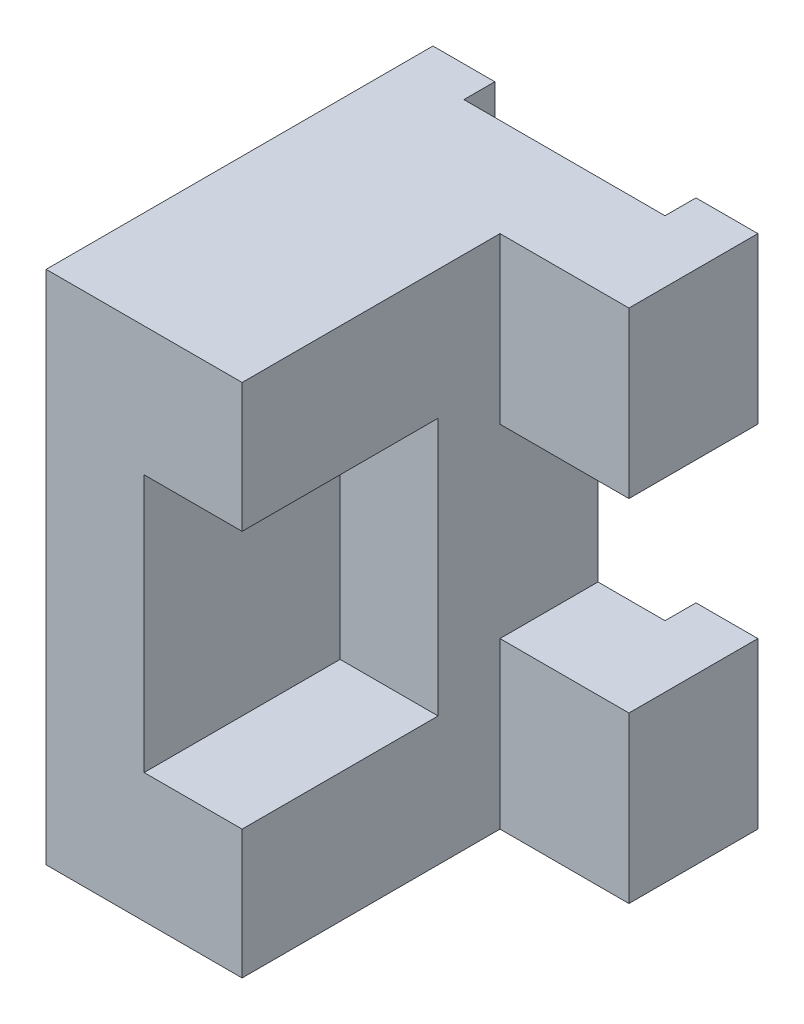
ISO-10303-21;
HEADER;
FILE_DESCRIPTION(('STEP AP214'),'2;1');
FILE_NAME('part.step','',(''),(''),'','','');
FILE_SCHEMA(('AUTOMOTIVE_DESIGN { 1 0 10303 214 1 1 1 1 }'));
ENDSEC;
DATA;
#1=APPLICATION_CONTEXT('core data for automotive mechanical design processes');
#2=APPLICATION_PROTOCOL_DEFINITION('international standard','automotive_design',2000,#1);
#3=PRODUCT_CONTEXT('',#1,'mechanical');
#4=PRODUCT('Part','Part','',(#3));
#5=PRODUCT_RELATED_PRODUCT_CATEGORY('part','',(#4));
#6=PRODUCT_DEFINITION_FORMATION('','',#4);
#7=PRODUCT_DEFINITION_CONTEXT('part definition',#1,'design');
#8=PRODUCT_DEFINITION('design','',#6,#7);
#9=PRODUCT_DEFINITION_SHAPE('','',#8);
#10=(LENGTH_UNIT() NAMED_UNIT(*) SI_UNIT(.MILLI.,.METRE.));
#11=(NAMED_UNIT(*) PLANE_ANGLE_UNIT() SI_UNIT($,.RADIAN.));
#12=(NAMED_UNIT(*) SI_UNIT($,.STERADIAN.) SOLID_ANGLE_UNIT());
#13=UNCERTAINTY_MEASURE_WITH_UNIT(LENGTH_MEASURE(1.E-05),#10,'distance_accuracy_value','');
#14=(GEOMETRIC_REPRESENTATION_CONTEXT(3) GLOBAL_UNCERTAINTY_ASSIGNED_CONTEXT((#13)) GLOBAL_UNIT_ASSIGNED_CONTEXT((#10,
#11,#12)) REPRESENTATION_CONTEXT('',''));
#15=CARTESIAN_POINT('',(0.,0.,0.));
#16=DIRECTION('',(0.,0.,1.));
#17=DIRECTION('',(1.,0.,0.));
#18=AXIS2_PLACEMENT_3D('',#15,#16,#17);
#19=CARTESIAN_POINT('',(0.,50.,25.0000000000028));
#20=DIRECTION('',(-1.,0.,0.));
#21=DIRECTION('',(0.,0.,1.));
#22=AXIS2_PLACEMENT_3D('',#19,#20,#21);
#23=PLANE('',#22);
#24=DIRECTION('',(0.,-1.,0.));
#25=VECTOR('',#24,1.);
#26=CARTESIAN_POINT('',(0.,50.,0.));
#27=LINE('',#26,#25);
#28=CARTESIAN_POINT('',(0.,-18.,0.));
#29=VERTEX_POINT('',#28);
#30=CARTESIAN_POINT('',(0.,-50.,0.));
#31=VERTEX_POINT('',#30);
#32=EDGE_CURVE('E47',#29,#31,#27,.T.);
#33=ORIENTED_EDGE('',*,*,#32,.F.);
#34=DIRECTION('',(0.,0.,1.));
#35=VECTOR('',#34,1.);
#36=CARTESIAN_POINT('',(0.,-18.,-12.9999999999972));
#37=LINE('',#36,#35);
#38=CARTESIAN_POINT('',(0.,-18.,25.0000000000028));
#39=VERTEX_POINT('',#38);
#40=EDGE_CURVE('E352',#29,#39,#37,.T.);
#41=ORIENTED_EDGE('',*,*,#40,.T.);
#42=DIRECTION('',(0.,-1.,0.));
#43=VECTOR('',#42,1.);
#44=CARTESIAN_POINT('',(0.,50.,25.0000000000028));
#45=LINE('',#44,#43);
#46=CARTESIAN_POINT('',(0.,-50.,25.0000000000028));
#47=VERTEX_POINT('',#46);
#48=EDGE_CURVE('E304',#39,#47,#45,.T.);
#49=ORIENTED_EDGE('',*,*,#48,.T.);
#50=DIRECTION('',(0.,0.,-1.));
#51=VECTOR('',#50,1.);
#52=CARTESIAN_POINT('',(0.,-50.,25.0000000000028));
#53=LINE('',#52,#51);
#54=EDGE_CURVE('E253',#47,#31,#53,.T.);
#55=ORIENTED_EDGE('',*,*,#54,.T.);
#56=EDGE_LOOP('',(#33,#41,#49,#55));
#57=FACE_BOUND('',#56,.T.);
#58=ADVANCED_FACE('F39',(#57),#23,.F.);
#59=CARTESIAN_POINT('',(0.,50.,0.));
#60=DIRECTION('',(0.,0.,1.));
#61=DIRECTION('',(1.,0.,0.));
#62=AXIS2_PLACEMENT_3D('',#59,#60,#61);
#63=PLANE('',#62);
#64=DIRECTION('',(0.,-1.,0.));
#65=VECTOR('',#64,1.);
#66=CARTESIAN_POINT('',(-12.,50.,0.));
#67=LINE('',#66,#65);
#68=CARTESIAN_POINT('',(-12.,-18.,0.));
#69=VERTEX_POINT('',#68);
#70=CARTESIAN_POINT('',(-12.,-50.,0.));
#71=VERTEX_POINT('',#70);
#72=EDGE_CURVE('E226',#69,#71,#67,.T.);
#73=ORIENTED_EDGE('',*,*,#72,.F.);
#74=DIRECTION('',(1.,0.,0.));
#75=VECTOR('',#74,1.);
#76=CARTESIAN_POINT('',(0.,-18.,0.));
#77=LINE('',#76,#75);
#78=EDGE_CURVE('E331',#69,#29,#77,.T.);
#79=ORIENTED_EDGE('',*,*,#78,.T.);
#80=ORIENTED_EDGE('',*,*,#32,.T.);
#81=DIRECTION('',(-1.,0.,0.));
#82=VECTOR('',#81,1.);
#83=CARTESIAN_POINT('',(0.,-50.,0.));
#84=LINE('',#83,#82);
#85=EDGE_CURVE('E247',#31,#71,#84,.T.);
#86=ORIENTED_EDGE('',*,*,#85,.T.);
#87=EDGE_LOOP('',(#73,#79,#80,#86));
#88=FACE_BOUND('',#87,.T.);
#89=ADVANCED_FACE('F248',(#88),#63,.F.);
#90=CARTESIAN_POINT('',(-12.,50.,0.));
#91=DIRECTION('',(1.,0.,0.));
#92=DIRECTION('',(0.,0.,-1.));
#93=AXIS2_PLACEMENT_3D('',#90,#91,#92);
#94=PLANE('',#93);
#95=DIRECTION('',(0.,-1.,0.));
#96=VECTOR('',#95,1.);
#97=CARTESIAN_POINT('',(-12.,50.,6.));
#98=LINE('',#97,#96);
#99=CARTESIAN_POINT('',(-12.,-18.,6.));
#100=VERTEX_POINT('',#99);
#101=CARTESIAN_POINT('',(-12.,-50.,6.));
#102=VERTEX_POINT('',#101);
#103=EDGE_CURVE('E223',#100,#102,#98,.T.);
#104=ORIENTED_EDGE('',*,*,#103,.F.);
#105=DIRECTION('',(0.,0.,-1.));
#106=VECTOR('',#105,1.);
#107=CARTESIAN_POINT('',(-12.,-18.,0.));
#108=LINE('',#107,#106);
#109=EDGE_CURVE('E243',#100,#69,#108,.T.);
#110=ORIENTED_EDGE('',*,*,#109,.T.);
#111=ORIENTED_EDGE('',*,*,#72,.T.);
#112=DIRECTION('',(0.,0.,1.));
#113=VECTOR('',#112,1.);
#114=CARTESIAN_POINT('',(-12.,-50.,0.));
#115=LINE('',#114,#113);
#116=EDGE_CURVE('E241',#71,#102,#115,.T.);
#117=ORIENTED_EDGE('',*,*,#116,.T.);
#118=EDGE_LOOP('',(#104,#110,#111,#117));
#119=FACE_BOUND('',#118,.T.);
#120=ADVANCED_FACE('F239',(#119),#94,.F.);
#121=CARTESIAN_POINT('',(-25.,50.,25.0000000000028));
#122=DIRECTION('',(0.,0.,-1.));
#123=DIRECTION('',(-1.,0.,0.));
#124=AXIS2_PLACEMENT_3D('',#121,#122,#123);
#125=PLANE('',#124);
#126=ORIENTED_EDGE('',*,*,#48,.F.);
#127=DIRECTION('',(1.,0.,0.));
#128=VECTOR('',#127,1.);
#129=CARTESIAN_POINT('',(0.,-18.,25.0000000000028));
#130=LINE('',#129,#128);
#131=CARTESIAN_POINT('',(-25.,-18.,25.0000000000028));
#132=VERTEX_POINT('',#131);
#133=EDGE_CURVE('E197',#132,#39,#130,.T.);
#134=ORIENTED_EDGE('',*,*,#133,.F.);
#135=DIRECTION('',(0.,-1.,0.));
#136=VECTOR('',#135,1.);
#137=CARTESIAN_POINT('',(-25.,50.,25.0000000000028));
#138=LINE('',#137,#136);
#139=CARTESIAN_POINT('',(-25.,-50.,25.0000000000028));
#140=VERTEX_POINT('',#139);
#141=EDGE_CURVE('E202',#132,#140,#138,.T.);
#142=ORIENTED_EDGE('',*,*,#141,.T.);
#143=DIRECTION('',(1.,0.,0.));
#144=VECTOR('',#143,1.);
#145=CARTESIAN_POINT('',(-25.,-50.,25.0000000000028));
#146=LINE('',#145,#144);
#147=EDGE_CURVE('E273',#140,#47,#146,.T.);
#148=ORIENTED_EDGE('',*,*,#147,.T.);
#149=EDGE_LOOP('',(#126,#134,#142,#148));
#150=FACE_BOUND('',#149,.T.);
#151=ADVANCED_FACE('F361',(#150),#125,.F.);
#152=CARTESIAN_POINT('',(0.,50.,25.0000000000028));
#153=VERTEX_POINT('',#152);
#154=CARTESIAN_POINT('',(0.,18.,25.0000000000028));
#155=VERTEX_POINT('',#154);
#156=EDGE_CURVE('E206',#153,#155,#45,.T.);
#157=ORIENTED_EDGE('',*,*,#156,.T.);
#158=DIRECTION('',(0.,0.,1.));
#159=VECTOR('',#158,1.);
#160=CARTESIAN_POINT('',(0.,18.,-12.9999999999972));
#161=LINE('',#160,#159);
#162=CARTESIAN_POINT('',(0.,18.,0.));
#163=VERTEX_POINT('',#162);
#164=EDGE_CURVE('E54',#163,#155,#161,.T.);
#165=ORIENTED_EDGE('',*,*,#164,.F.);
#166=CARTESIAN_POINT('',(0.,50.,0.));
#167=VERTEX_POINT('',#166);
#168=EDGE_CURVE('E11',#167,#163,#27,.T.);
#169=ORIENTED_EDGE('',*,*,#168,.F.);
#170=DIRECTION('',(0.,0.,-1.));
#171=VECTOR('',#170,1.);
#172=CARTESIAN_POINT('',(0.,50.,25.0000000000028));
#173=LINE('',#172,#171);
#174=EDGE_CURVE('E275',#153,#167,#173,.T.);
#175=ORIENTED_EDGE('',*,*,#174,.F.);
#176=EDGE_LOOP('',(#157,#165,#169,#175));
#177=FACE_BOUND('',#176,.T.);
#178=ADVANCED_FACE('F41',(#177),#23,.F.);
#179=ORIENTED_EDGE('',*,*,#168,.T.);
#180=DIRECTION('',(-1.,0.,0.));
#181=VECTOR('',#180,1.);
#182=CARTESIAN_POINT('',(0.,18.,0.));
#183=LINE('',#182,#181);
#184=CARTESIAN_POINT('',(-12.,18.,0.));
#185=VERTEX_POINT('',#184);
#186=EDGE_CURVE('E345',#163,#185,#183,.T.);
#187=ORIENTED_EDGE('',*,*,#186,.T.);
#188=CARTESIAN_POINT('',(-12.,50.,0.));
#189=VERTEX_POINT('',#188);
#190=EDGE_CURVE('E227',#189,#185,#67,.T.);
#191=ORIENTED_EDGE('',*,*,#190,.F.);
#192=DIRECTION('',(-1.,0.,0.));
#193=VECTOR('',#192,1.);
#194=CARTESIAN_POINT('',(0.,50.,0.));
#195=LINE('',#194,#193);
#196=EDGE_CURVE('E280',#167,#189,#195,.T.);
#197=ORIENTED_EDGE('',*,*,#196,.F.);
#198=EDGE_LOOP('',(#179,#187,#191,#197));
#199=FACE_BOUND('',#198,.T.);
#200=ADVANCED_FACE('F364',(#199),#63,.F.);
#201=ORIENTED_EDGE('',*,*,#190,.T.);
#202=DIRECTION('',(0.,0.,1.));
#203=VECTOR('',#202,1.);
#204=CARTESIAN_POINT('',(-12.,18.,0.));
#205=LINE('',#204,#203);
#206=CARTESIAN_POINT('',(-12.,18.,6.));
#207=VERTEX_POINT('',#206);
#208=EDGE_CURVE('E348',#185,#207,#205,.T.);
#209=ORIENTED_EDGE('',*,*,#208,.T.);
#210=CARTESIAN_POINT('',(-12.,50.,6.));
#211=VERTEX_POINT('',#210);
#212=EDGE_CURVE('E224',#211,#207,#98,.T.);
#213=ORIENTED_EDGE('',*,*,#212,.F.);
#214=DIRECTION('',(0.,0.,1.));
#215=VECTOR('',#214,1.);
#216=CARTESIAN_POINT('',(-12.,50.,0.));
#217=LINE('',#216,#215);
#218=EDGE_CURVE('E285',#189,#211,#217,.T.);
#219=ORIENTED_EDGE('',*,*,#218,.F.);
#220=EDGE_LOOP('',(#201,#209,#213,#219));
#221=FACE_BOUND('',#220,.T.);
#222=ADVANCED_FACE('F369',(#221),#94,.F.);
#223=CARTESIAN_POINT('',(-12.,50.,6.));
#224=DIRECTION('',(0.,0.,1.));
#225=DIRECTION('',(1.,0.,0.));
#226=AXIS2_PLACEMENT_3D('',#223,#224,#225);
#227=PLANE('',#226);
#228=DIRECTION('',(0.,-1.,0.));
#229=VECTOR('',#228,1.);
#230=CARTESIAN_POINT('',(-25.,50.,6.));
#231=LINE('',#230,#229);
#232=CARTESIAN_POINT('',(-25.,18.,6.));
#233=VERTEX_POINT('',#232);
#234=CARTESIAN_POINT('',(-25.,-18.,6.));
#235=VERTEX_POINT('',#234);
#236=EDGE_CURVE('E188',#233,#235,#231,.T.);
#237=ORIENTED_EDGE('',*,*,#236,.T.);
#238=DIRECTION('',(1.,0.,0.));
#239=VECTOR('',#238,1.);
#240=CARTESIAN_POINT('',(-12.,-18.,6.));
#241=LINE('',#240,#239);
#242=EDGE_CURVE('E341',#235,#100,#241,.T.);
#243=ORIENTED_EDGE('',*,*,#242,.T.);
#244=ORIENTED_EDGE('',*,*,#103,.T.);
#245=DIRECTION('',(-1.,0.,0.));
#246=VECTOR('',#245,1.);
#247=CARTESIAN_POINT('',(-12.,-50.,6.));
#248=LINE('',#247,#246);
#249=CARTESIAN_POINT('',(-51.,-50.,6.));
#250=VERTEX_POINT('',#249);
#251=EDGE_CURVE('E257',#102,#250,#248,.T.);
#252=ORIENTED_EDGE('',*,*,#251,.T.);
#253=DIRECTION('',(0.,-1.,0.));
#254=VECTOR('',#253,1.);
#255=CARTESIAN_POINT('',(-51.,50.,6.));
#256=LINE('',#255,#254);
#257=CARTESIAN_POINT('',(-51.,50.,6.));
#258=VERTEX_POINT('',#257);
#259=EDGE_CURVE('E220',#258,#250,#256,.T.);
#260=ORIENTED_EDGE('',*,*,#259,.F.);
#261=DIRECTION('',(-1.,0.,0.));
#262=VECTOR('',#261,1.);
#263=CARTESIAN_POINT('',(-12.,50.,6.));
#264=LINE('',#263,#262);
#265=EDGE_CURVE('E292',#211,#258,#264,.T.);
#266=ORIENTED_EDGE('',*,*,#265,.F.);
#267=ORIENTED_EDGE('',*,*,#212,.T.);
#268=DIRECTION('',(-1.,0.,0.));
#269=VECTOR('',#268,1.);
#270=CARTESIAN_POINT('',(-12.,18.,6.));
#271=LINE('',#270,#269);
#272=EDGE_CURVE('E350',#207,#233,#271,.T.);
#273=ORIENTED_EDGE('',*,*,#272,.T.);
#274=EDGE_LOOP('',(#237,#243,#244,#252,#260,#266,#267,#273));
#275=FACE_BOUND('',#274,.T.);
#276=ADVANCED_FACE('F371',(#275),#227,.F.);
#277=CARTESIAN_POINT('',(-51.,50.,6.));
#278=DIRECTION('',(-1.,0.,0.));
#279=DIRECTION('',(0.,0.,1.));
#280=AXIS2_PLACEMENT_3D('',#277,#278,#279);
#281=PLANE('',#280);
#282=DIRECTION('',(0.,0.,-1.));
#283=VECTOR('',#282,1.);
#284=CARTESIAN_POINT('',(-51.,-50.,6.));
#285=LINE('',#284,#283);
#286=CARTESIAN_POINT('',(-51.,-50.,0.));
#287=VERTEX_POINT('',#286);
#288=EDGE_CURVE('E259',#250,#287,#285,.T.);
#289=ORIENTED_EDGE('',*,*,#288,.T.);
#290=DIRECTION('',(0.,-1.,0.));
#291=VECTOR('',#290,1.);
#292=CARTESIAN_POINT('',(-51.,50.,0.));
#293=LINE('',#292,#291);
#294=CARTESIAN_POINT('',(-51.,50.,0.));
#295=VERTEX_POINT('',#294);
#296=EDGE_CURVE('E217',#295,#287,#293,.T.);
#297=ORIENTED_EDGE('',*,*,#296,.F.);
#298=DIRECTION('',(0.,0.,-1.));
#299=VECTOR('',#298,1.);
#300=CARTESIAN_POINT('',(-51.,50.,6.));
#301=LINE('',#300,#299);
#302=EDGE_CURVE('E294',#258,#295,#301,.T.);
#303=ORIENTED_EDGE('',*,*,#302,.F.);
#304=ORIENTED_EDGE('',*,*,#259,.T.);
#305=EDGE_LOOP('',(#289,#297,#303,#304));
#306=FACE_BOUND('',#305,.T.);
#307=ADVANCED_FACE('F375',(#306),#281,.F.);
#308=CARTESIAN_POINT('',(-51.,50.,0.));
#309=DIRECTION('',(0.,0.,1.));
#310=DIRECTION('',(1.,0.,0.));
#311=AXIS2_PLACEMENT_3D('',#308,#309,#310);
#312=PLANE('',#311);
#313=DIRECTION('',(-1.,0.,0.));
#314=VECTOR('',#313,1.);
#315=CARTESIAN_POINT('',(-51.,-50.,0.));
#316=LINE('',#315,#314);
#317=CARTESIAN_POINT('',(-63.,-50.,0.));
#318=VERTEX_POINT('',#317);
#319=EDGE_CURVE('E264',#287,#318,#316,.T.);
#320=ORIENTED_EDGE('',*,*,#319,.T.);
#321=DIRECTION('',(0.,-1.,0.));
#322=VECTOR('',#321,1.);
#323=CARTESIAN_POINT('',(-63.,50.,0.));
#324=LINE('',#323,#322);
#325=CARTESIAN_POINT('',(-63.,50.,0.));
#326=VERTEX_POINT('',#325);
#327=EDGE_CURVE('E214',#326,#318,#324,.T.);
#328=ORIENTED_EDGE('',*,*,#327,.F.);
#329=DIRECTION('',(-1.,0.,0.));
#330=VECTOR('',#329,1.);
#331=CARTESIAN_POINT('',(-51.,50.,0.));
#332=LINE('',#331,#330);
#333=EDGE_CURVE('E296',#295,#326,#332,.T.);
#334=ORIENTED_EDGE('',*,*,#333,.F.);
#335=ORIENTED_EDGE('',*,*,#296,.T.);
#336=EDGE_LOOP('',(#320,#328,#334,#335));
#337=FACE_BOUND('',#336,.T.);
#338=ADVANCED_FACE('F381',(#337),#312,.F.);
#339=CARTESIAN_POINT('',(-63.,50.,0.));
#340=DIRECTION('',(1.,0.,0.));
#341=DIRECTION('',(0.,0.,-1.));
#342=AXIS2_PLACEMENT_3D('',#339,#340,#341);
#343=PLANE('',#342);
#344=DIRECTION('',(0.,0.,1.));
#345=VECTOR('',#344,1.);
#346=CARTESIAN_POINT('',(-63.,-50.,0.));
#347=LINE('',#346,#345);
#348=CARTESIAN_POINT('',(-63.,-50.,75.));
#349=VERTEX_POINT('',#348);
#350=EDGE_CURVE('E266',#318,#349,#347,.T.);
#351=ORIENTED_EDGE('',*,*,#350,.T.);
#352=DIRECTION('',(0.,-1.,0.));
#353=VECTOR('',#352,1.);
#354=CARTESIAN_POINT('',(-63.,50.,75.));
#355=LINE('',#354,#353);
#356=CARTESIAN_POINT('',(-63.,50.,75.));
#357=VERTEX_POINT('',#356);
#358=EDGE_CURVE('E211',#357,#349,#355,.T.);
#359=ORIENTED_EDGE('',*,*,#358,.F.);
#360=DIRECTION('',(0.,0.,1.));
#361=VECTOR('',#360,1.);
#362=CARTESIAN_POINT('',(-63.,50.,0.));
#363=LINE('',#362,#361);
#364=EDGE_CURVE('E298',#326,#357,#363,.T.);
#365=ORIENTED_EDGE('',*,*,#364,.F.);
#366=ORIENTED_EDGE('',*,*,#327,.T.);
#367=EDGE_LOOP('',(#351,#359,#365,#366));
#368=FACE_BOUND('',#367,.T.);
#369=ADVANCED_FACE('F385',(#368),#343,.F.);
#370=CARTESIAN_POINT('',(-63.,50.,75.));
#371=DIRECTION('',(0.,0.,-1.));
#372=DIRECTION('',(-1.,0.,0.));
#373=AXIS2_PLACEMENT_3D('',#370,#371,#372);
#374=PLANE('',#373);
#375=DIRECTION('',(0.,-1.,0.));
#376=VECTOR('',#375,1.);
#377=CARTESIAN_POINT('',(-25.,50.,75.));
#378=LINE('',#377,#376);
#379=CARTESIAN_POINT('',(-25.,-25.,75.));
#380=VERTEX_POINT('',#379);
#381=CARTESIAN_POINT('',(-25.,-50.,75.));
#382=VERTEX_POINT('',#381);
#383=EDGE_CURVE('E201',#380,#382,#378,.T.);
#384=ORIENTED_EDGE('',*,*,#383,.F.);
#385=DIRECTION('',(1.,0.,0.));
#386=VECTOR('',#385,1.);
#387=CARTESIAN_POINT('',(-44.,-25.,75.));
#388=LINE('',#387,#386);
#389=CARTESIAN_POINT('',(-44.,-25.,75.));
#390=VERTEX_POINT('',#389);
#391=EDGE_CURVE('E314',#390,#380,#388,.T.);
#392=ORIENTED_EDGE('',*,*,#391,.F.);
#393=DIRECTION('',(0.,-1.,0.));
#394=VECTOR('',#393,1.);
#395=CARTESIAN_POINT('',(-44.,25.,75.));
#396=LINE('',#395,#394);
#397=CARTESIAN_POINT('',(-44.,25.,75.));
#398=VERTEX_POINT('',#397);
#399=EDGE_CURVE('E330',#398,#390,#396,.T.);
#400=ORIENTED_EDGE('',*,*,#399,.F.);
#401=DIRECTION('',(-1.,0.,0.));
#402=VECTOR('',#401,1.);
#403=CARTESIAN_POINT('',(-25.,25.,75.));
#404=LINE('',#403,#402);
#405=CARTESIAN_POINT('',(-25.,25.,75.));
#406=VERTEX_POINT('',#405);
#407=EDGE_CURVE('E329',#406,#398,#404,.T.);
#408=ORIENTED_EDGE('',*,*,#407,.F.);
#409=CARTESIAN_POINT('',(-25.,50.,75.));
#410=VERTEX_POINT('',#409);
#411=EDGE_CURVE('E204',#410,#406,#378,.T.);
#412=ORIENTED_EDGE('',*,*,#411,.F.);
#413=DIRECTION('',(1.,0.,0.));
#414=VECTOR('',#413,1.);
#415=CARTESIAN_POINT('',(-63.,50.,75.));
#416=LINE('',#415,#414);
#417=EDGE_CURVE('E300',#357,#410,#416,.T.);
#418=ORIENTED_EDGE('',*,*,#417,.F.);
#419=ORIENTED_EDGE('',*,*,#358,.T.);
#420=DIRECTION('',(1.,0.,0.));
#421=VECTOR('',#420,1.);
#422=CARTESIAN_POINT('',(-63.,-50.,75.));
#423=LINE('',#422,#421);
#424=EDGE_CURVE('E268',#349,#382,#423,.T.);
#425=ORIENTED_EDGE('',*,*,#424,.T.);
#426=EDGE_LOOP('',(#384,#392,#400,#408,#412,#418,#419,#425));
#427=FACE_BOUND('',#426,.T.);
#428=ADVANCED_FACE('F390',(#427),#374,.F.);
#429=CARTESIAN_POINT('',(-25.,50.,75.));
#430=DIRECTION('',(-1.,0.,0.));
#431=DIRECTION('',(0.,0.,1.));
#432=AXIS2_PLACEMENT_3D('',#429,#430,#431);
#433=PLANE('',#432);
#434=DIRECTION('',(0.,1.,0.));
#435=VECTOR('',#434,1.);
#436=CARTESIAN_POINT('',(-25.,-25.,37.));
#437=LINE('',#436,#435);
#438=CARTESIAN_POINT('',(-25.,-25.,37.));
#439=VERTEX_POINT('',#438);
#440=CARTESIAN_POINT('',(-25.,25.,37.));
#441=VERTEX_POINT('',#440);
#442=EDGE_CURVE('E334',#439,#441,#437,.T.);
#443=ORIENTED_EDGE('',*,*,#442,.F.);
#444=DIRECTION('',(0.,0.,1.));
#445=VECTOR('',#444,1.);
#446=CARTESIAN_POINT('',(-25.,-25.,37.));
#447=LINE('',#446,#445);
#448=EDGE_CURVE('E305',#439,#380,#447,.T.);
#449=ORIENTED_EDGE('',*,*,#448,.T.);
#450=ORIENTED_EDGE('',*,*,#383,.T.);
#451=DIRECTION('',(0.,0.,-1.));
#452=VECTOR('',#451,1.);
#453=CARTESIAN_POINT('',(-25.,-50.,75.));
#454=LINE('',#453,#452);
#455=EDGE_CURVE('E271',#382,#140,#454,.T.);
#456=ORIENTED_EDGE('',*,*,#455,.T.);
#457=ORIENTED_EDGE('',*,*,#141,.F.);
#458=DIRECTION('',(0.,0.,1.));
#459=VECTOR('',#458,1.);
#460=CARTESIAN_POINT('',(-25.,-18.,-12.9999999999972));
#461=LINE('',#460,#459);
#462=EDGE_CURVE('E190',#235,#132,#461,.T.);
#463=ORIENTED_EDGE('',*,*,#462,.F.);
#464=ORIENTED_EDGE('',*,*,#236,.F.);
#465=DIRECTION('',(0.,0.,1.));
#466=VECTOR('',#465,1.);
#467=CARTESIAN_POINT('',(-25.,18.,-12.9999999999972));
#468=LINE('',#467,#466);
#469=CARTESIAN_POINT('',(-25.,18.,25.0000000000028));
#470=VERTEX_POINT('',#469);
#471=EDGE_CURVE('E179',#233,#470,#468,.T.);
#472=ORIENTED_EDGE('',*,*,#471,.T.);
#473=CARTESIAN_POINT('',(-25.,50.,25.0000000000028));
#474=VERTEX_POINT('',#473);
#475=EDGE_CURVE('E184',#474,#470,#138,.T.);
#476=ORIENTED_EDGE('',*,*,#475,.F.);
#477=DIRECTION('',(0.,0.,-1.));
#478=VECTOR('',#477,1.);
#479=CARTESIAN_POINT('',(-25.,50.,75.));
#480=LINE('',#479,#478);
#481=EDGE_CURVE('E302',#410,#474,#480,.T.);
#482=ORIENTED_EDGE('',*,*,#481,.F.);
#483=ORIENTED_EDGE('',*,*,#411,.T.);
#484=DIRECTION('',(0.,0.,1.));
#485=VECTOR('',#484,1.);
#486=CARTESIAN_POINT('',(-25.,25.,37.));
#487=LINE('',#486,#485);
#488=EDGE_CURVE('E288',#441,#406,#487,.T.);
#489=ORIENTED_EDGE('',*,*,#488,.F.);
#490=EDGE_LOOP('',(#443,#449,#450,#456,#457,#463,#464,#472,#476,#482,#483,#489));
#491=FACE_BOUND('',#490,.T.);
#492=ADVANCED_FACE('F181',(#491),#433,.F.);
#493=ORIENTED_EDGE('',*,*,#475,.T.);
#494=DIRECTION('',(-1.,0.,0.));
#495=VECTOR('',#494,1.);
#496=CARTESIAN_POINT('',(0.,18.,25.0000000000028));
#497=LINE('',#496,#495);
#498=EDGE_CURVE('E192',#155,#470,#497,.T.);
#499=ORIENTED_EDGE('',*,*,#498,.F.);
#500=ORIENTED_EDGE('',*,*,#156,.F.);
#501=DIRECTION('',(1.,0.,0.));
#502=VECTOR('',#501,1.);
#503=CARTESIAN_POINT('',(-25.,50.,25.0000000000028));
#504=LINE('',#503,#502);
#505=EDGE_CURVE('E200',#474,#153,#504,.T.);
#506=ORIENTED_EDGE('',*,*,#505,.F.);
#507=EDGE_LOOP('',(#493,#499,#500,#506));
#508=FACE_BOUND('',#507,.T.);
#509=ADVANCED_FACE('F199',(#508),#125,.F.);
#510=CARTESIAN_POINT('',(0.,50.,0.));
#511=DIRECTION('',(0.,1.,0.));
#512=DIRECTION('',(0.,0.,1.));
#513=AXIS2_PLACEMENT_3D('',#510,#511,#512);
#514=PLANE('',#513);
#515=ORIENTED_EDGE('',*,*,#174,.T.);
#516=ORIENTED_EDGE('',*,*,#196,.T.);
#517=ORIENTED_EDGE('',*,*,#218,.T.);
#518=ORIENTED_EDGE('',*,*,#265,.T.);
#519=ORIENTED_EDGE('',*,*,#302,.T.);
#520=ORIENTED_EDGE('',*,*,#333,.T.);
#521=ORIENTED_EDGE('',*,*,#364,.T.);
#522=ORIENTED_EDGE('',*,*,#417,.T.);
#523=ORIENTED_EDGE('',*,*,#481,.T.);
#524=ORIENTED_EDGE('',*,*,#505,.T.);
#525=EDGE_LOOP('',(#515,#516,#517,#518,#519,#520,#521,#522,#523,#524));
#526=FACE_BOUND('',#525,.T.);
#527=ADVANCED_FACE('F365',(#526),#514,.T.);
#528=CARTESIAN_POINT('',(0.,-50.,0.));
#529=DIRECTION('',(0.,1.,0.));
#530=DIRECTION('',(0.,0.,1.));
#531=AXIS2_PLACEMENT_3D('',#528,#529,#530);
#532=PLANE('',#531);
#533=ORIENTED_EDGE('',*,*,#54,.F.);
#534=ORIENTED_EDGE('',*,*,#147,.F.);
#535=ORIENTED_EDGE('',*,*,#455,.F.);
#536=ORIENTED_EDGE('',*,*,#424,.F.);
#537=ORIENTED_EDGE('',*,*,#350,.F.);
#538=ORIENTED_EDGE('',*,*,#319,.F.);
#539=ORIENTED_EDGE('',*,*,#288,.F.);
#540=ORIENTED_EDGE('',*,*,#251,.F.);
#541=ORIENTED_EDGE('',*,*,#116,.F.);
#542=ORIENTED_EDGE('',*,*,#85,.F.);
#543=EDGE_LOOP('',(#533,#534,#535,#536,#537,#538,#539,#540,#541,#542));
#544=FACE_BOUND('',#543,.T.);
#545=ADVANCED_FACE('F255',(#544),#532,.F.);
#546=CARTESIAN_POINT('',(-44.,-25.,37.));
#547=DIRECTION('',(0.,-1.,0.));
#548=DIRECTION('',(1.,0.,0.));
#549=AXIS2_PLACEMENT_3D('',#546,#547,#548);
#550=PLANE('',#549);
#551=ORIENTED_EDGE('',*,*,#391,.T.);
#552=ORIENTED_EDGE('',*,*,#448,.F.);
#553=DIRECTION('',(1.,0.,0.));
#554=VECTOR('',#553,1.);
#555=CARTESIAN_POINT('',(-44.,-25.,37.));
#556=LINE('',#555,#554);
#557=CARTESIAN_POINT('',(-44.,-25.,37.));
#558=VERTEX_POINT('',#557);
#559=EDGE_CURVE('E62',#558,#439,#556,.T.);
#560=ORIENTED_EDGE('',*,*,#559,.F.);
#561=DIRECTION('',(0.,0.,1.));
#562=VECTOR('',#561,1.);
#563=CARTESIAN_POINT('',(-44.,-25.,37.));
#564=LINE('',#563,#562);
#565=EDGE_CURVE('E308',#558,#390,#564,.T.);
#566=ORIENTED_EDGE('',*,*,#565,.T.);
#567=EDGE_LOOP('',(#551,#552,#560,#566));
#568=FACE_BOUND('',#567,.T.);
#569=ADVANCED_FACE('F502',(#568),#550,.F.);
#570=CARTESIAN_POINT('',(-44.,25.,37.));
#571=DIRECTION('',(-1.,0.,0.));
#572=DIRECTION('',(0.,0.,1.));
#573=AXIS2_PLACEMENT_3D('',#570,#571,#572);
#574=PLANE('',#573);
#575=ORIENTED_EDGE('',*,*,#399,.T.);
#576=ORIENTED_EDGE('',*,*,#565,.F.);
#577=DIRECTION('',(0.,-1.,0.));
#578=VECTOR('',#577,1.);
#579=CARTESIAN_POINT('',(-44.,25.,37.));
#580=LINE('',#579,#578);
#581=CARTESIAN_POINT('',(-44.,25.,37.));
#582=VERTEX_POINT('',#581);
#583=EDGE_CURVE('E323',#582,#558,#580,.T.);
#584=ORIENTED_EDGE('',*,*,#583,.F.);
#585=DIRECTION('',(0.,0.,1.));
#586=VECTOR('',#585,1.);
#587=CARTESIAN_POINT('',(-44.,25.,37.));
#588=LINE('',#587,#586);
#589=EDGE_CURVE('E311',#582,#398,#588,.T.);
#590=ORIENTED_EDGE('',*,*,#589,.T.);
#591=EDGE_LOOP('',(#575,#576,#584,#590));
#592=FACE_BOUND('',#591,.T.);
#593=ADVANCED_FACE('F392',(#592),#574,.F.);
#594=CARTESIAN_POINT('',(-25.,25.,37.));
#595=DIRECTION('',(0.,1.,0.));
#596=DIRECTION('',(-1.,0.,0.));
#597=AXIS2_PLACEMENT_3D('',#594,#595,#596);
#598=PLANE('',#597);
#599=ORIENTED_EDGE('',*,*,#407,.T.);
#600=ORIENTED_EDGE('',*,*,#589,.F.);
#601=DIRECTION('',(-1.,0.,0.));
#602=VECTOR('',#601,1.);
#603=CARTESIAN_POINT('',(-25.,25.,37.));
#604=LINE('',#603,#602);
#605=EDGE_CURVE('E325',#441,#582,#604,.T.);
#606=ORIENTED_EDGE('',*,*,#605,.F.);
#607=ORIENTED_EDGE('',*,*,#488,.T.);
#608=EDGE_LOOP('',(#599,#600,#606,#607));
#609=FACE_BOUND('',#608,.T.);
#610=ADVANCED_FACE('F391',(#609),#598,.F.);
#611=CARTESIAN_POINT('',(0.,0.,37.));
#612=DIRECTION('',(0.,0.,1.));
#613=DIRECTION('',(1.,0.,0.));
#614=AXIS2_PLACEMENT_3D('',#611,#612,#613);
#615=PLANE('',#614);
#616=ORIENTED_EDGE('',*,*,#442,.T.);
#617=ORIENTED_EDGE('',*,*,#605,.T.);
#618=ORIENTED_EDGE('',*,*,#583,.T.);
#619=ORIENTED_EDGE('',*,*,#559,.T.);
#620=EDGE_LOOP('',(#616,#617,#618,#619));
#621=FACE_BOUND('',#620,.T.);
#622=ADVANCED_FACE('F393',(#621),#615,.T.);
#623=CARTESIAN_POINT('',(0.,-18.,-12.9999999999972));
#624=DIRECTION('',(0.,-1.,0.));
#625=DIRECTION('',(1.,0.,0.));
#626=AXIS2_PLACEMENT_3D('',#623,#624,#625);
#627=PLANE('',#626);
#628=ORIENTED_EDGE('',*,*,#109,.F.);
#629=ORIENTED_EDGE('',*,*,#242,.F.);
#630=ORIENTED_EDGE('',*,*,#462,.T.);
#631=ORIENTED_EDGE('',*,*,#133,.T.);
#632=ORIENTED_EDGE('',*,*,#40,.F.);
#633=ORIENTED_EDGE('',*,*,#78,.F.);
#634=EDGE_LOOP('',(#628,#629,#630,#631,#632,#633));
#635=FACE_BOUND('',#634,.T.);
#636=ADVANCED_FACE('F359',(#635),#627,.F.);
#637=CARTESIAN_POINT('',(0.,18.,-12.9999999999972));
#638=DIRECTION('',(0.,1.,0.));
#639=DIRECTION('',(-1.,0.,0.));
#640=AXIS2_PLACEMENT_3D('',#637,#638,#639);
#641=PLANE('',#640);
#642=ORIENTED_EDGE('',*,*,#164,.T.);
#643=ORIENTED_EDGE('',*,*,#498,.T.);
#644=ORIENTED_EDGE('',*,*,#471,.F.);
#645=ORIENTED_EDGE('',*,*,#272,.F.);
#646=ORIENTED_EDGE('',*,*,#208,.F.);
#647=ORIENTED_EDGE('',*,*,#186,.F.);
#648=EDGE_LOOP('',(#642,#643,#644,#645,#646,#647));
#649=FACE_BOUND('',#648,.T.);
#650=ADVANCED_FACE('F193',(#649),#641,.F.);
#651=CLOSED_SHELL('',(#58,#89,#120,#151,#178,#200,#222,#276,#307,#338,#369,#428,#492,#509,#527,
#545,#569,#593,#610,#622,#636,#650));
#652=MANIFOLD_SOLID_BREP('B2',#651);
#653=ADVANCED_BREP_SHAPE_REPRESENTATION('',(#18,#652),#14);
#654=SHAPE_DEFINITION_REPRESENTATION(#9,#653);
ENDSEC;
END-ISO-10303-21;
